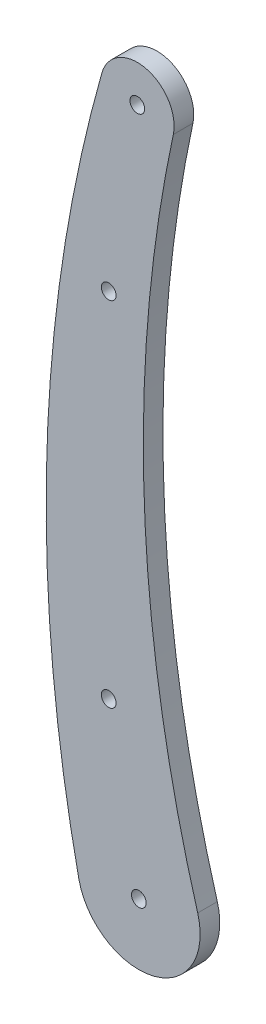
ISO-10303-21;
HEADER;
FILE_DESCRIPTION(('STEP AP214'),'2;1');
FILE_NAME('part.step','',(''),(''),'','','');
FILE_SCHEMA(('AUTOMOTIVE_DESIGN { 1 0 10303 214 1 1 1 1 }'));
ENDSEC;
DATA;
#1=APPLICATION_CONTEXT('core data for automotive mechanical design processes');
#2=APPLICATION_PROTOCOL_DEFINITION('international standard','automotive_design',2000,#1);
#3=PRODUCT_CONTEXT('',#1,'mechanical');
#4=PRODUCT('Part','Part','',(#3));
#5=PRODUCT_RELATED_PRODUCT_CATEGORY('part','',(#4));
#6=PRODUCT_DEFINITION_FORMATION('','',#4);
#7=PRODUCT_DEFINITION_CONTEXT('part definition',#1,'design');
#8=PRODUCT_DEFINITION('design','',#6,#7);
#9=PRODUCT_DEFINITION_SHAPE('','',#8);
#10=(LENGTH_UNIT() NAMED_UNIT(*) SI_UNIT(.MILLI.,.METRE.));
#11=(NAMED_UNIT(*) PLANE_ANGLE_UNIT() SI_UNIT($,.RADIAN.));
#12=(NAMED_UNIT(*) SI_UNIT($,.STERADIAN.) SOLID_ANGLE_UNIT());
#13=UNCERTAINTY_MEASURE_WITH_UNIT(LENGTH_MEASURE(1.E-05),#10,'distance_accuracy_value','');
#14=(GEOMETRIC_REPRESENTATION_CONTEXT(3) GLOBAL_UNCERTAINTY_ASSIGNED_CONTEXT((#13)) GLOBAL_UNIT_ASSIGNED_CONTEXT((#10,
#11,#12)) REPRESENTATION_CONTEXT('',''));
#15=CARTESIAN_POINT('',(0.,0.,0.));
#16=DIRECTION('',(0.,0.,1.));
#17=DIRECTION('',(1.,0.,0.));
#18=AXIS2_PLACEMENT_3D('',#15,#16,#17);
#19=CARTESIAN_POINT('',(137.957829025341,40.3943054231007,4.));
#20=DIRECTION('',(0.,0.,1.));
#21=DIRECTION('',(1.,0.,0.));
#22=AXIS2_PLACEMENT_3D('',#19,#20,#21);
#23=PLANE('',#22);
#24=CARTESIAN_POINT('',(-6.14211543162091,32.2137494634089,4.));
#25=DIRECTION('',(0.,0.,1.));
#26=DIRECTION('',(1.,0.,0.));
#27=AXIS2_PLACEMENT_3D('',#24,#25,#26);
#28=CIRCLE('',#27,1.5);
#29=CARTESIAN_POINT('',(-4.64211543162091,32.2137494634089,4.));
#30=VERTEX_POINT('',#29);
#31=EDGE_CURVE('E121',#30,#30,#28,.T.);
#32=ORIENTED_EDGE('',*,*,#31,.F.);
#33=EDGE_LOOP('',(#32));
#34=FACE_BOUND('',#33,.T.);
#35=CARTESIAN_POINT('',(-6.14211543162091,104.166670734742,4.));
#36=DIRECTION('',(0.,0.,1.));
#37=DIRECTION('',(1.,0.,0.));
#38=AXIS2_PLACEMENT_3D('',#35,#36,#37);
#39=CIRCLE('',#38,1.5);
#40=CARTESIAN_POINT('',(-4.64211543162091,104.166670734742,4.));
#41=VERTEX_POINT('',#40);
#42=EDGE_CURVE('E110',#41,#41,#39,.T.);
#43=ORIENTED_EDGE('',*,*,#42,.F.);
#44=EDGE_LOOP('',(#43));
#45=FACE_BOUND('',#44,.T.);
#46=CARTESIAN_POINT('',(0.,0.,4.));
#47=DIRECTION('',(0.,0.,1.));
#48=DIRECTION('',(1.,0.,0.));
#49=AXIS2_PLACEMENT_3D('',#46,#47,#48);
#50=CIRCLE('',#49,1.5);
#51=CARTESIAN_POINT('',(1.5,0.,4.));
#52=VERTEX_POINT('',#51);
#53=EDGE_CURVE('E102',#52,#52,#50,.T.);
#54=ORIENTED_EDGE('',*,*,#53,.F.);
#55=EDGE_LOOP('',(#54));
#56=FACE_BOUND('',#55,.T.);
#57=CARTESIAN_POINT('',(275.915658050682,80.7886108462015,4.));
#58=DIRECTION('',(0.,0.,-1.));
#59=DIRECTION('',(1.,0.,0.));
#60=AXIS2_PLACEMENT_3D('',#57,#58,#59);
#61=CIRCLE('',#60,275.);
#62=CARTESIAN_POINT('',(11.9963329587253,3.51254829766093,4.));
#63=VERTEX_POINT('',#62);
#64=CARTESIAN_POINT('',(7.02397479696329,138.42768333164,4.));
#65=VERTEX_POINT('',#64);
#66=EDGE_CURVE('E86',#63,#65,#61,.T.);
#67=ORIENTED_EDGE('',*,*,#66,.T.);
#68=CARTESIAN_POINT('',(-0.309434746319955,139.999658035789,4.));
#69=DIRECTION('',(0.,0.,1.));
#70=DIRECTION('',(1.,0.,0.));
#71=AXIS2_PLACEMENT_3D('',#68,#69,#70);
#72=CIRCLE('',#71,7.5);
#73=CARTESIAN_POINT('',(-7.52539193567164,142.044153533814,4.));
#74=VERTEX_POINT('',#73);
#75=EDGE_CURVE('E81',#65,#74,#72,.T.);
#76=ORIENTED_EDGE('',*,*,#75,.T.);
#77=CARTESIAN_POINT('',(281.112895638395,60.2643336128175,4.));
#78=DIRECTION('',(0.,0.,1.));
#79=DIRECTION('',(1.,0.,0.));
#80=AXIS2_PLACEMENT_3D('',#77,#78,#79);
#81=CIRCLE('',#80,300.);
#82=CARTESIAN_POINT('',(-12.222299810365,-2.62018841794858,4.));
#83=VERTEX_POINT('',#82);
#84=EDGE_CURVE('E84',#74,#83,#81,.T.);
#85=ORIENTED_EDGE('',*,*,#84,.T.);
#86=CARTESIAN_POINT('',(0.,0.,4.));
#87=DIRECTION('',(0.,0.,1.));
#88=DIRECTION('',(1.,0.,0.));
#89=AXIS2_PLACEMENT_3D('',#86,#87,#88);
#90=CIRCLE('',#89,12.5);
#91=EDGE_CURVE('E51',#83,#63,#90,.T.);
#92=ORIENTED_EDGE('',*,*,#91,.T.);
#93=EDGE_LOOP('',(#67,#76,#85,#92));
#94=FACE_BOUND('',#93,.T.);
#95=CARTESIAN_POINT('',(-0.309434746319955,139.999658035789,4.));
#96=DIRECTION('',(0.,0.,1.));
#97=DIRECTION('',(1.,0.,0.));
#98=AXIS2_PLACEMENT_3D('',#95,#96,#97);
#99=CIRCLE('',#98,1.5);
#100=CARTESIAN_POINT('',(1.19056525368005,139.999658035789,4.));
#101=VERTEX_POINT('',#100);
#102=EDGE_CURVE('E114',#101,#101,#99,.T.);
#103=ORIENTED_EDGE('',*,*,#102,.F.);
#104=EDGE_LOOP('',(#103));
#105=FACE_BOUND('',#104,.T.);
#106=ADVANCED_FACE('F32',(#34,#45,#56,#94,#105),#23,.T.);
#107=CARTESIAN_POINT('',(137.957829025341,40.3943054231007,0.));
#108=DIRECTION('',(0.,0.,1.));
#109=DIRECTION('',(1.,0.,0.));
#110=AXIS2_PLACEMENT_3D('',#107,#108,#109);
#111=PLANE('',#110);
#112=CARTESIAN_POINT('',(-6.14211543162091,32.2137494634089,0.));
#113=DIRECTION('',(0.,0.,1.));
#114=DIRECTION('',(1.,0.,0.));
#115=AXIS2_PLACEMENT_3D('',#112,#113,#114);
#116=CIRCLE('',#115,1.5);
#117=CARTESIAN_POINT('',(-4.64211543162091,32.2137494634089,0.));
#118=VERTEX_POINT('',#117);
#119=EDGE_CURVE('E36',#118,#118,#116,.T.);
#120=ORIENTED_EDGE('',*,*,#119,.T.);
#121=EDGE_LOOP('',(#120));
#122=FACE_BOUND('',#121,.T.);
#123=CARTESIAN_POINT('',(-6.14211543162091,104.166670734742,0.));
#124=DIRECTION('',(0.,0.,1.));
#125=DIRECTION('',(1.,0.,0.));
#126=AXIS2_PLACEMENT_3D('',#123,#124,#125);
#127=CIRCLE('',#126,1.5);
#128=CARTESIAN_POINT('',(-4.64211543162091,104.166670734742,0.));
#129=VERTEX_POINT('',#128);
#130=EDGE_CURVE('E107',#129,#129,#127,.T.);
#131=ORIENTED_EDGE('',*,*,#130,.T.);
#132=EDGE_LOOP('',(#131));
#133=FACE_BOUND('',#132,.T.);
#134=CARTESIAN_POINT('',(0.,0.,0.));
#135=DIRECTION('',(0.,0.,1.));
#136=DIRECTION('',(1.,0.,0.));
#137=AXIS2_PLACEMENT_3D('',#134,#135,#136);
#138=CIRCLE('',#137,1.5);
#139=CARTESIAN_POINT('',(1.5,0.,0.));
#140=VERTEX_POINT('',#139);
#141=EDGE_CURVE('E125',#140,#140,#138,.T.);
#142=ORIENTED_EDGE('',*,*,#141,.T.);
#143=EDGE_LOOP('',(#142));
#144=FACE_BOUND('',#143,.T.);
#145=CARTESIAN_POINT('',(275.915658050682,80.7886108462015,0.));
#146=DIRECTION('',(0.,0.,-1.));
#147=DIRECTION('',(1.,0.,0.));
#148=AXIS2_PLACEMENT_3D('',#145,#146,#147);
#149=CIRCLE('',#148,275.);
#150=CARTESIAN_POINT('',(11.9963329587253,3.51254829766093,0.));
#151=VERTEX_POINT('',#150);
#152=CARTESIAN_POINT('',(7.02397479696329,138.42768333164,0.));
#153=VERTEX_POINT('',#152);
#154=EDGE_CURVE('E99',#151,#153,#149,.T.);
#155=ORIENTED_EDGE('',*,*,#154,.F.);
#156=CARTESIAN_POINT('',(0.,0.,0.));
#157=DIRECTION('',(0.,0.,1.));
#158=DIRECTION('',(1.,0.,0.));
#159=AXIS2_PLACEMENT_3D('',#156,#157,#158);
#160=CIRCLE('',#159,12.5);
#161=CARTESIAN_POINT('',(-12.222299810365,-2.62018841794858,0.));
#162=VERTEX_POINT('',#161);
#163=EDGE_CURVE('E74',#162,#151,#160,.T.);
#164=ORIENTED_EDGE('',*,*,#163,.F.);
#165=CARTESIAN_POINT('',(281.112895638395,60.2643336128175,0.));
#166=DIRECTION('',(0.,0.,1.));
#167=DIRECTION('',(1.,0.,0.));
#168=AXIS2_PLACEMENT_3D('',#165,#166,#167);
#169=CIRCLE('',#168,300.);
#170=CARTESIAN_POINT('',(-7.52539193567164,142.044153533814,0.));
#171=VERTEX_POINT('',#170);
#172=EDGE_CURVE('E68',#171,#162,#169,.T.);
#173=ORIENTED_EDGE('',*,*,#172,.F.);
#174=CARTESIAN_POINT('',(-0.309434746319955,139.999658035789,0.));
#175=DIRECTION('',(0.,0.,1.));
#176=DIRECTION('',(1.,0.,0.));
#177=AXIS2_PLACEMENT_3D('',#174,#175,#176);
#178=CIRCLE('',#177,7.5);
#179=EDGE_CURVE('E90',#153,#171,#178,.T.);
#180=ORIENTED_EDGE('',*,*,#179,.F.);
#181=EDGE_LOOP('',(#155,#164,#173,#180));
#182=FACE_BOUND('',#181,.T.);
#183=CARTESIAN_POINT('',(-0.309434746319955,139.999658035789,0.));
#184=DIRECTION('',(0.,0.,1.));
#185=DIRECTION('',(1.,0.,0.));
#186=AXIS2_PLACEMENT_3D('',#183,#184,#185);
#187=CIRCLE('',#186,1.5);
#188=CARTESIAN_POINT('',(1.19056525368005,139.999658035789,0.));
#189=VERTEX_POINT('',#188);
#190=EDGE_CURVE('E109',#189,#189,#187,.T.);
#191=ORIENTED_EDGE('',*,*,#190,.T.);
#192=EDGE_LOOP('',(#191));
#193=FACE_BOUND('',#192,.T.);
#194=ADVANCED_FACE('F132',(#122,#133,#144,#182,#193),#111,.F.);
#195=CARTESIAN_POINT('',(275.915658050682,80.7886108462015,4.));
#196=DIRECTION('',(0.,0.,-1.));
#197=DIRECTION('',(-1.,0.,0.));
#198=AXIS2_PLACEMENT_3D('',#195,#196,#197);
#199=CYLINDRICAL_SURFACE('',#198,275.);
#200=ORIENTED_EDGE('',*,*,#154,.T.);
#201=DIRECTION('',(0.,0.,-1.));
#202=VECTOR('',#201,1.);
#203=CARTESIAN_POINT('',(7.02397479696329,138.42768333164,4.));
#204=LINE('',#203,#202);
#205=EDGE_CURVE('E11',#65,#153,#204,.T.);
#206=ORIENTED_EDGE('',*,*,#205,.F.);
#207=ORIENTED_EDGE('',*,*,#66,.F.);
#208=DIRECTION('',(0.,0.,-1.));
#209=VECTOR('',#208,1.);
#210=CARTESIAN_POINT('',(11.9963329587253,3.51254829766093,4.));
#211=LINE('',#210,#209);
#212=EDGE_CURVE('E95',#63,#151,#211,.T.);
#213=ORIENTED_EDGE('',*,*,#212,.T.);
#214=EDGE_LOOP('',(#200,#206,#207,#213));
#215=FACE_BOUND('',#214,.T.);
#216=ADVANCED_FACE('F34',(#215),#199,.F.);
#217=CARTESIAN_POINT('',(-0.309434746319955,139.999658035789,4.));
#218=DIRECTION('',(0.,0.,-1.));
#219=DIRECTION('',(-1.,0.,0.));
#220=AXIS2_PLACEMENT_3D('',#217,#218,#219);
#221=CYLINDRICAL_SURFACE('',#220,7.5);
#222=ORIENTED_EDGE('',*,*,#179,.T.);
#223=DIRECTION('',(0.,0.,-1.));
#224=VECTOR('',#223,1.);
#225=CARTESIAN_POINT('',(-7.52539193567164,142.044153533814,4.));
#226=LINE('',#225,#224);
#227=EDGE_CURVE('E42',#74,#171,#226,.T.);
#228=ORIENTED_EDGE('',*,*,#227,.F.);
#229=ORIENTED_EDGE('',*,*,#75,.F.);
#230=ORIENTED_EDGE('',*,*,#205,.T.);
#231=EDGE_LOOP('',(#222,#228,#229,#230));
#232=FACE_BOUND('',#231,.T.);
#233=ADVANCED_FACE('F89',(#232),#221,.T.);
#234=CARTESIAN_POINT('',(281.112895638395,60.2643336128175,4.));
#235=DIRECTION('',(0.,0.,-1.));
#236=DIRECTION('',(-1.,0.,0.));
#237=AXIS2_PLACEMENT_3D('',#234,#235,#236);
#238=CYLINDRICAL_SURFACE('',#237,300.);
#239=ORIENTED_EDGE('',*,*,#172,.T.);
#240=DIRECTION('',(0.,0.,-1.));
#241=VECTOR('',#240,1.);
#242=CARTESIAN_POINT('',(-12.222299810365,-2.62018841794858,4.));
#243=LINE('',#242,#241);
#244=EDGE_CURVE('E91',#83,#162,#243,.T.);
#245=ORIENTED_EDGE('',*,*,#244,.F.);
#246=ORIENTED_EDGE('',*,*,#84,.F.);
#247=ORIENTED_EDGE('',*,*,#227,.T.);
#248=EDGE_LOOP('',(#239,#245,#246,#247));
#249=FACE_BOUND('',#248,.T.);
#250=ADVANCED_FACE('F93',(#249),#238,.T.);
#251=CARTESIAN_POINT('',(0.,0.,4.));
#252=DIRECTION('',(0.,0.,-1.));
#253=DIRECTION('',(-1.,0.,0.));
#254=AXIS2_PLACEMENT_3D('',#251,#252,#253);
#255=CYLINDRICAL_SURFACE('',#254,12.5);
#256=ORIENTED_EDGE('',*,*,#163,.T.);
#257=ORIENTED_EDGE('',*,*,#212,.F.);
#258=ORIENTED_EDGE('',*,*,#91,.F.);
#259=ORIENTED_EDGE('',*,*,#244,.T.);
#260=EDGE_LOOP('',(#256,#257,#258,#259));
#261=FACE_BOUND('',#260,.T.);
#262=ADVANCED_FACE('F138',(#261),#255,.T.);
#263=CARTESIAN_POINT('',(0.,0.,4.));
#264=DIRECTION('',(0.,0.,-1.));
#265=DIRECTION('',(-1.,0.,0.));
#266=AXIS2_PLACEMENT_3D('',#263,#264,#265);
#267=CYLINDRICAL_SURFACE('',#266,1.5);
#268=ORIENTED_EDGE('',*,*,#53,.T.);
#269=EDGE_LOOP('',(#268));
#270=FACE_BOUND('',#269,.T.);
#271=ORIENTED_EDGE('',*,*,#141,.F.);
#272=EDGE_LOOP('',(#271));
#273=FACE_BOUND('',#272,.T.);
#274=ADVANCED_FACE('F135',(#270,#273),#267,.F.);
#275=CARTESIAN_POINT('',(-0.309434746319955,139.999658035789,4.));
#276=DIRECTION('',(0.,0.,-1.));
#277=DIRECTION('',(-1.,0.,0.));
#278=AXIS2_PLACEMENT_3D('',#275,#276,#277);
#279=CYLINDRICAL_SURFACE('',#278,1.5);
#280=ORIENTED_EDGE('',*,*,#102,.T.);
#281=EDGE_LOOP('',(#280));
#282=FACE_BOUND('',#281,.T.);
#283=ORIENTED_EDGE('',*,*,#190,.F.);
#284=EDGE_LOOP('',(#283));
#285=FACE_BOUND('',#284,.T.);
#286=ADVANCED_FACE('F137',(#282,#285),#279,.F.);
#287=CARTESIAN_POINT('',(-6.14211543162091,104.166670734742,-21.));
#288=DIRECTION('',(0.,0.,1.));
#289=DIRECTION('',(1.,0.,0.));
#290=AXIS2_PLACEMENT_3D('',#287,#288,#289);
#291=CYLINDRICAL_SURFACE('',#290,1.5);
#292=ORIENTED_EDGE('',*,*,#42,.T.);
#293=EDGE_LOOP('',(#292));
#294=FACE_BOUND('',#293,.T.);
#295=ORIENTED_EDGE('',*,*,#130,.F.);
#296=EDGE_LOOP('',(#295));
#297=FACE_BOUND('',#296,.T.);
#298=ADVANCED_FACE('F145',(#294,#297),#291,.F.);
#299=CARTESIAN_POINT('',(-6.14211543162091,32.2137494634089,-21.));
#300=DIRECTION('',(0.,0.,1.));
#301=DIRECTION('',(1.,0.,0.));
#302=AXIS2_PLACEMENT_3D('',#299,#300,#301);
#303=CYLINDRICAL_SURFACE('',#302,1.5);
#304=ORIENTED_EDGE('',*,*,#31,.T.);
#305=EDGE_LOOP('',(#304));
#306=FACE_BOUND('',#305,.T.);
#307=ORIENTED_EDGE('',*,*,#119,.F.);
#308=EDGE_LOOP('',(#307));
#309=FACE_BOUND('',#308,.T.);
#310=ADVANCED_FACE('F188',(#306,#309),#303,.F.);
#311=CLOSED_SHELL('',(#106,#194,#216,#233,#250,#262,#274,#286,#298,#310));
#312=MANIFOLD_SOLID_BREP('B2',#311);
#313=ADVANCED_BREP_SHAPE_REPRESENTATION('',(#18,#312),#14);
#314=SHAPE_DEFINITION_REPRESENTATION(#9,#313);
ENDSEC;
END-ISO-10303-21;
